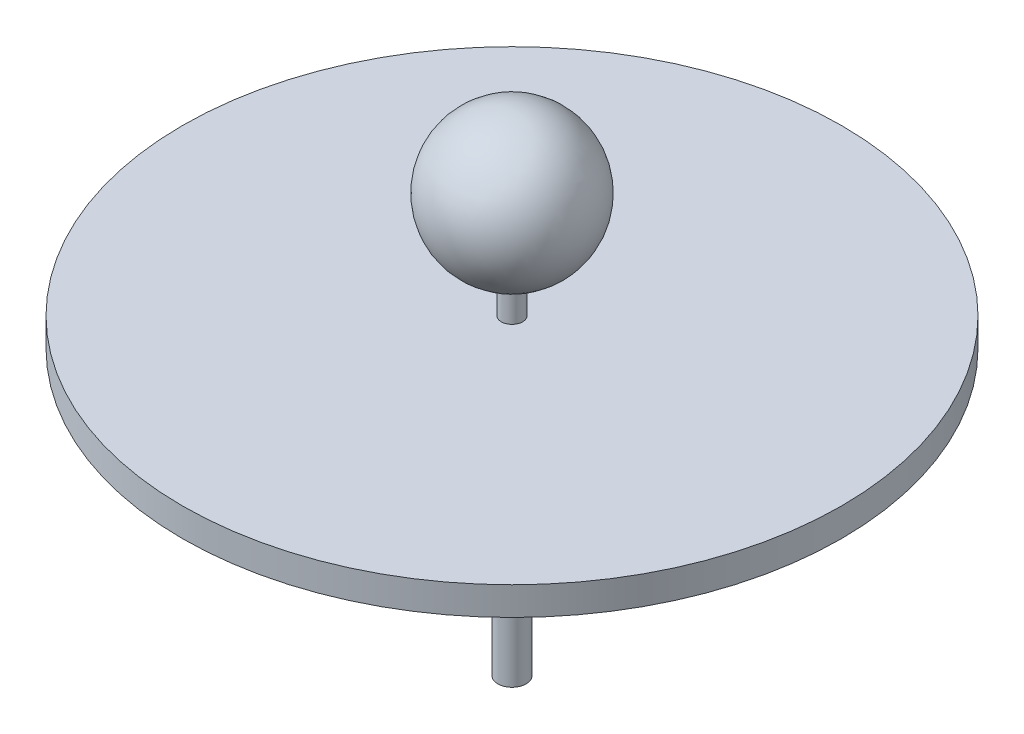
ISO-10303-21;
HEADER;
FILE_DESCRIPTION(('STEP AP214'),'2;1');
FILE_NAME('part.step','',(''),(''),'','','');
FILE_SCHEMA(('AUTOMOTIVE_DESIGN { 1 0 10303 214 1 1 1 1 }'));
ENDSEC;
DATA;
#1=APPLICATION_CONTEXT('core data for automotive mechanical design processes');
#2=APPLICATION_PROTOCOL_DEFINITION('international standard','automotive_design',2000,#1);
#3=PRODUCT_CONTEXT('',#1,'mechanical');
#4=PRODUCT('Part','Part','',(#3));
#5=PRODUCT_RELATED_PRODUCT_CATEGORY('part','',(#4));
#6=PRODUCT_DEFINITION_FORMATION('','',#4);
#7=PRODUCT_DEFINITION_CONTEXT('part definition',#1,'design');
#8=PRODUCT_DEFINITION('design','',#6,#7);
#9=PRODUCT_DEFINITION_SHAPE('','',#8);
#10=(LENGTH_UNIT() NAMED_UNIT(*) SI_UNIT(.MILLI.,.METRE.));
#11=(NAMED_UNIT(*) PLANE_ANGLE_UNIT() SI_UNIT($,.RADIAN.));
#12=(NAMED_UNIT(*) SI_UNIT($,.STERADIAN.) SOLID_ANGLE_UNIT());
#13=UNCERTAINTY_MEASURE_WITH_UNIT(LENGTH_MEASURE(1.E-05),#10,'distance_accuracy_value','');
#14=(GEOMETRIC_REPRESENTATION_CONTEXT(3) GLOBAL_UNCERTAINTY_ASSIGNED_CONTEXT((#13)) GLOBAL_UNIT_ASSIGNED_CONTEXT((#10,
#11,#12)) REPRESENTATION_CONTEXT('',''));
#15=CARTESIAN_POINT('',(0.,0.,0.));
#16=DIRECTION('',(0.,0.,1.));
#17=DIRECTION('',(1.,0.,0.));
#18=AXIS2_PLACEMENT_3D('',#15,#16,#17);
#19=CARTESIAN_POINT('',(0.,290.,0.));
#20=DIRECTION('',(0.,-1.,0.));
#21=DIRECTION('',(0.,0.,-1.));
#22=AXIS2_PLACEMENT_3D('',#19,#20,#21);
#23=CYLINDRICAL_SURFACE('',#22,15.);
#24=CARTESIAN_POINT('',(0.,290.,0.));
#25=DIRECTION('',(0.,-1.,0.));
#26=DIRECTION('',(0.,0.,-1.));
#27=AXIS2_PLACEMENT_3D('',#24,#25,#26);
#28=CIRCLE('',#27,15.);
#29=CARTESIAN_POINT('',(0.,290.,-15.));
#30=VERTEX_POINT('',#29);
#31=EDGE_CURVE('E10',#30,#30,#28,.T.);
#32=ORIENTED_EDGE('',*,*,#31,.T.);
#33=EDGE_LOOP('',(#32));
#34=FACE_BOUND('',#33,.T.);
#35=CARTESIAN_POINT('',(0.,240.,0.));
#36=DIRECTION('',(0.,-1.,0.));
#37=DIRECTION('',(0.,0.,-1.));
#38=AXIS2_PLACEMENT_3D('',#35,#36,#37);
#39=CIRCLE('',#38,15.);
#40=CARTESIAN_POINT('',(0.,240.,-15.));
#41=VERTEX_POINT('',#40);
#42=EDGE_CURVE('E60',#41,#41,#39,.T.);
#43=ORIENTED_EDGE('',*,*,#42,.F.);
#44=EDGE_LOOP('',(#43));
#45=FACE_BOUND('',#44,.T.);
#46=ADVANCED_FACE('F35',(#34,#45),#23,.T.);
#47=CARTESIAN_POINT('',(0.,390.,0.));
#48=DIRECTION('',(0.,-1.,0.));
#49=DIRECTION('',(1.,0.,0.));
#50=AXIS2_PLACEMENT_3D('',#47,#48,#49);
#51=SPHERICAL_SURFACE('',#50,101.118742080783);
#52=ORIENTED_EDGE('',*,*,#31,.F.);
#53=EDGE_LOOP('',(#52));
#54=FACE_BOUND('',#53,.T.);
#55=ADVANCED_FACE('F72',(#54),#51,.T.);
#56=CARTESIAN_POINT('',(0.,290.,0.));
#57=DIRECTION('',(0.,-1.,0.));
#58=DIRECTION('',(0.,0.,-1.));
#59=AXIS2_PLACEMENT_3D('',#56,#57,#58);
#60=CYLINDRICAL_SURFACE('',#59,20.);
#61=CARTESIAN_POINT('',(0.,100.,0.));
#62=DIRECTION('',(0.,-1.,0.));
#63=DIRECTION('',(0.,0.,-1.));
#64=AXIS2_PLACEMENT_3D('',#61,#62,#63);
#65=CIRCLE('',#64,20.);
#66=CARTESIAN_POINT('',(0.,100.,-20.));
#67=VERTEX_POINT('',#66);
#68=EDGE_CURVE('E41',#67,#67,#65,.T.);
#69=ORIENTED_EDGE('',*,*,#68,.T.);
#70=EDGE_LOOP('',(#69));
#71=FACE_BOUND('',#70,.T.);
#72=CARTESIAN_POINT('',(0.,-200.,0.));
#73=DIRECTION('',(0.,-1.,0.));
#74=DIRECTION('',(0.,0.,-1.));
#75=AXIS2_PLACEMENT_3D('',#72,#73,#74);
#76=CIRCLE('',#75,20.);
#77=CARTESIAN_POINT('',(0.,-200.,-20.));
#78=VERTEX_POINT('',#77);
#79=EDGE_CURVE('E63',#78,#78,#76,.T.);
#80=ORIENTED_EDGE('',*,*,#79,.F.);
#81=EDGE_LOOP('',(#80));
#82=FACE_BOUND('',#81,.T.);
#83=ADVANCED_FACE('F69',(#71,#82),#60,.T.);
#84=CARTESIAN_POINT('',(0.,100.,0.));
#85=DIRECTION('',(0.,1.,0.));
#86=DIRECTION('',(0.,0.,1.));
#87=AXIS2_PLACEMENT_3D('',#84,#85,#86);
#88=PLANE('',#87);
#89=CARTESIAN_POINT('',(0.,100.,0.));
#90=DIRECTION('',(0.,-1.,0.));
#91=DIRECTION('',(0.,0.,-1.));
#92=AXIS2_PLACEMENT_3D('',#89,#90,#91);
#93=CIRCLE('',#92,15.);
#94=CARTESIAN_POINT('',(0.,100.,-15.));
#95=VERTEX_POINT('',#94);
#96=EDGE_CURVE('E45',#95,#95,#93,.T.);
#97=ORIENTED_EDGE('',*,*,#96,.T.);
#98=EDGE_LOOP('',(#97));
#99=FACE_BOUND('',#98,.T.);
#100=ORIENTED_EDGE('',*,*,#68,.F.);
#101=EDGE_LOOP('',(#100));
#102=FACE_BOUND('',#101,.T.);
#103=ADVANCED_FACE('F71',(#99,#102),#88,.T.);
#104=CARTESIAN_POINT('',(0.,290.,0.));
#105=DIRECTION('',(0.,-1.,0.));
#106=DIRECTION('',(0.,0.,-1.));
#107=AXIS2_PLACEMENT_3D('',#104,#105,#106);
#108=CYLINDRICAL_SURFACE('',#107,15.);
#109=CARTESIAN_POINT('',(0.,200.,0.));
#110=DIRECTION('',(0.,-1.,0.));
#111=DIRECTION('',(0.,0.,-1.));
#112=AXIS2_PLACEMENT_3D('',#109,#110,#111);
#113=CIRCLE('',#112,15.);
#114=CARTESIAN_POINT('',(0.,200.,-15.));
#115=VERTEX_POINT('',#114);
#116=EDGE_CURVE('E49',#115,#115,#113,.T.);
#117=ORIENTED_EDGE('',*,*,#116,.T.);
#118=EDGE_LOOP('',(#117));
#119=FACE_BOUND('',#118,.T.);
#120=ORIENTED_EDGE('',*,*,#96,.F.);
#121=EDGE_LOOP('',(#120));
#122=FACE_BOUND('',#121,.T.);
#123=ADVANCED_FACE('F79',(#119,#122),#108,.T.);
#124=CARTESIAN_POINT('',(0.,200.,0.));
#125=DIRECTION('',(0.,-1.,0.));
#126=DIRECTION('',(0.,0.,-1.));
#127=AXIS2_PLACEMENT_3D('',#124,#125,#126);
#128=PLANE('',#127);
#129=CARTESIAN_POINT('',(0.,200.,0.));
#130=DIRECTION('',(0.,-1.,0.));
#131=DIRECTION('',(0.,0.,-1.));
#132=AXIS2_PLACEMENT_3D('',#129,#130,#131);
#133=CIRCLE('',#132,465.);
#134=CARTESIAN_POINT('',(0.,200.,-465.));
#135=VERTEX_POINT('',#134);
#136=EDGE_CURVE('E54',#135,#135,#133,.T.);
#137=ORIENTED_EDGE('',*,*,#136,.T.);
#138=EDGE_LOOP('',(#137));
#139=FACE_BOUND('',#138,.T.);
#140=ORIENTED_EDGE('',*,*,#116,.F.);
#141=EDGE_LOOP('',(#140));
#142=FACE_BOUND('',#141,.T.);
#143=ADVANCED_FACE('F98',(#139,#142),#128,.T.);
#144=CARTESIAN_POINT('',(0.,290.,0.));
#145=DIRECTION('',(0.,-1.,0.));
#146=DIRECTION('',(0.,0.,-1.));
#147=AXIS2_PLACEMENT_3D('',#144,#145,#146);
#148=CYLINDRICAL_SURFACE('',#147,465.);
#149=CARTESIAN_POINT('',(0.,240.,0.));
#150=DIRECTION('',(0.,-1.,0.));
#151=DIRECTION('',(0.,0.,-1.));
#152=AXIS2_PLACEMENT_3D('',#149,#150,#151);
#153=CIRCLE('',#152,465.);
#154=CARTESIAN_POINT('',(0.,240.,-465.));
#155=VERTEX_POINT('',#154);
#156=EDGE_CURVE('E57',#155,#155,#153,.T.);
#157=ORIENTED_EDGE('',*,*,#156,.T.);
#158=EDGE_LOOP('',(#157));
#159=FACE_BOUND('',#158,.T.);
#160=ORIENTED_EDGE('',*,*,#136,.F.);
#161=EDGE_LOOP('',(#160));
#162=FACE_BOUND('',#161,.T.);
#163=ADVANCED_FACE('F92',(#159,#162),#148,.T.);
#164=CARTESIAN_POINT('',(0.,240.,0.));
#165=DIRECTION('',(0.,1.,0.));
#166=DIRECTION('',(0.,0.,1.));
#167=AXIS2_PLACEMENT_3D('',#164,#165,#166);
#168=PLANE('',#167);
#169=ORIENTED_EDGE('',*,*,#42,.T.);
#170=EDGE_LOOP('',(#169));
#171=FACE_BOUND('',#170,.T.);
#172=ORIENTED_EDGE('',*,*,#156,.F.);
#173=EDGE_LOOP('',(#172));
#174=FACE_BOUND('',#173,.T.);
#175=ADVANCED_FACE('F90',(#171,#174),#168,.T.);
#176=CARTESIAN_POINT('',(0.,-200.,0.));
#177=DIRECTION('',(0.,-1.,0.));
#178=DIRECTION('',(0.,0.,-1.));
#179=AXIS2_PLACEMENT_3D('',#176,#177,#178);
#180=PLANE('',#179);
#181=ORIENTED_EDGE('',*,*,#79,.T.);
#182=EDGE_LOOP('',(#181));
#183=FACE_BOUND('',#182,.T.);
#184=ADVANCED_FACE('F67',(#183),#180,.T.);
#185=CLOSED_SHELL('',(#46,#55,#83,#103,#123,#143,#163,#175,#184));
#186=MANIFOLD_SOLID_BREP('B2',#185);
#187=ADVANCED_BREP_SHAPE_REPRESENTATION('',(#18,#186),#14);
#188=SHAPE_DEFINITION_REPRESENTATION(#9,#187);
ENDSEC;
END-ISO-10303-21;
